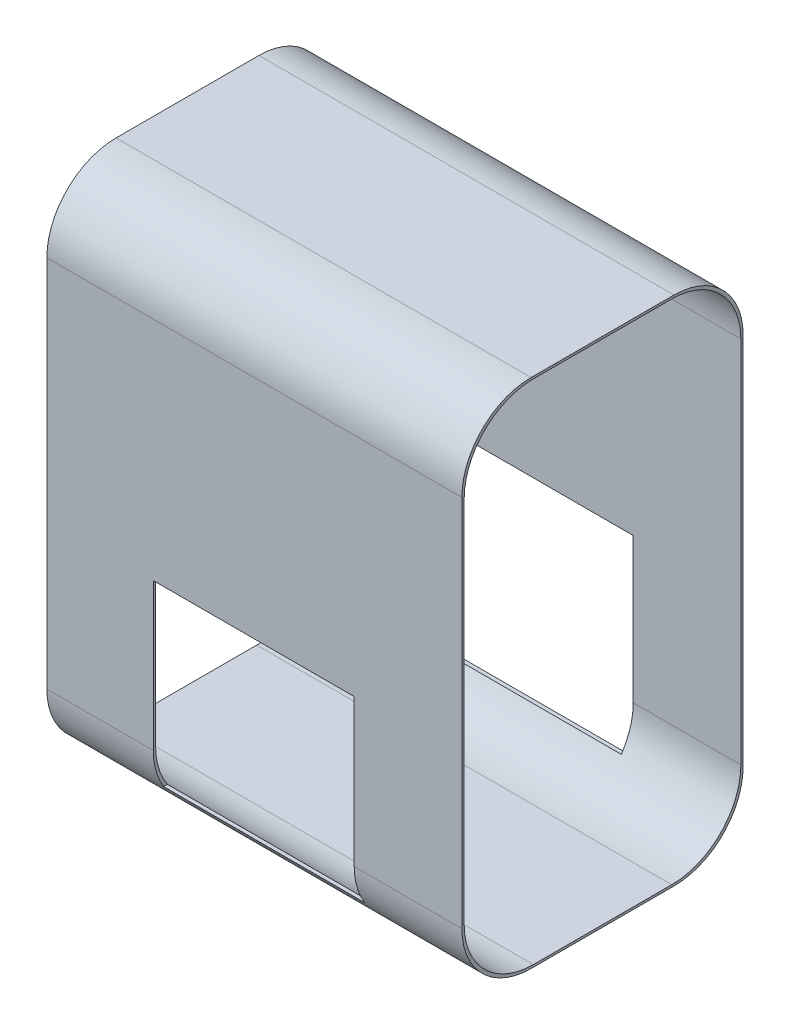
ISO-10303-21;
HEADER;
FILE_DESCRIPTION(('STEP AP214'),'2;1');
FILE_NAME('part.step','',(''),(''),'','','');
FILE_SCHEMA(('AUTOMOTIVE_DESIGN { 1 0 10303 214 1 1 1 1 }'));
ENDSEC;
DATA;
#1=APPLICATION_CONTEXT('core data for automotive mechanical design processes');
#2=APPLICATION_PROTOCOL_DEFINITION('international standard','automotive_design',2000,#1);
#3=PRODUCT_CONTEXT('',#1,'mechanical');
#4=PRODUCT('Part','Part','',(#3));
#5=PRODUCT_RELATED_PRODUCT_CATEGORY('part','',(#4));
#6=PRODUCT_DEFINITION_FORMATION('','',#4);
#7=PRODUCT_DEFINITION_CONTEXT('part definition',#1,'design');
#8=PRODUCT_DEFINITION('design','',#6,#7);
#9=PRODUCT_DEFINITION_SHAPE('','',#8);
#10=(LENGTH_UNIT() NAMED_UNIT(*) SI_UNIT(.MILLI.,.METRE.));
#11=(NAMED_UNIT(*) PLANE_ANGLE_UNIT() SI_UNIT($,.RADIAN.));
#12=(NAMED_UNIT(*) SI_UNIT($,.STERADIAN.) SOLID_ANGLE_UNIT());
#13=UNCERTAINTY_MEASURE_WITH_UNIT(LENGTH_MEASURE(1.E-05),#10,'distance_accuracy_value','');
#14=(GEOMETRIC_REPRESENTATION_CONTEXT(3) GLOBAL_UNCERTAINTY_ASSIGNED_CONTEXT((#13)) GLOBAL_UNIT_ASSIGNED_CONTEXT((#10,
#11,#12)) REPRESENTATION_CONTEXT('',''));
#15=CARTESIAN_POINT('',(0.,0.,0.));
#16=DIRECTION('',(0.,0.,1.));
#17=DIRECTION('',(1.,0.,0.));
#18=AXIS2_PLACEMENT_3D('',#15,#16,#17);
#19=CARTESIAN_POINT('',(4.33194494247,-1.71717262268,-6.1));
#20=DIRECTION('',(0.,1.,0.));
#21=DIRECTION('',(1.,0.,0.));
#22=AXIS2_PLACEMENT_3D('',#19,#20,#21);
#23=PLANE('',#22);
#24=DIRECTION('',(-1.,0.,0.));
#25=VECTOR('',#24,1.);
#26=CARTESIAN_POINT('',(-0.026050567627,-1.71717262268,-6.));
#27=LINE('',#26,#25);
#28=CARTESIAN_POINT('',(4.33194494247,-1.71717262268,-6.));
#29=VERTEX_POINT('',#28);
#30=CARTESIAN_POINT('',(-4.38404607773,-1.71717262268,-6.));
#31=VERTEX_POINT('',#30);
#32=EDGE_CURVE('E403',#29,#31,#27,.T.);
#33=ORIENTED_EDGE('',*,*,#32,.T.);
#34=DIRECTION('',(0.,0.,1.));
#35=VECTOR('',#34,1.);
#36=CARTESIAN_POINT('',(-4.38404607773,-1.71717262268,-6.05));
#37=LINE('',#36,#35);
#38=CARTESIAN_POINT('',(-4.38404607773,-1.71717262268,-6.1));
#39=VERTEX_POINT('',#38);
#40=EDGE_CURVE('E27',#39,#31,#37,.T.);
#41=ORIENTED_EDGE('',*,*,#40,.F.);
#42=DIRECTION('',(1.,0.,0.));
#43=VECTOR('',#42,1.);
#44=CARTESIAN_POINT('',(-0.026050567627,-1.71717262268,-6.1));
#45=LINE('',#44,#43);
#46=CARTESIAN_POINT('',(4.33194494247,-1.71717262268,-6.1));
#47=VERTEX_POINT('',#46);
#48=EDGE_CURVE('E344',#39,#47,#45,.T.);
#49=ORIENTED_EDGE('',*,*,#48,.T.);
#50=DIRECTION('',(0.,0.,1.));
#51=VECTOR('',#50,1.);
#52=CARTESIAN_POINT('',(4.33194494247,-1.71717262268,-6.05));
#53=LINE('',#52,#51);
#54=EDGE_CURVE('E11',#47,#29,#53,.T.);
#55=ORIENTED_EDGE('',*,*,#54,.T.);
#56=EDGE_LOOP('',(#33,#41,#49,#55));
#57=FACE_BOUND('',#56,.T.);
#58=ADVANCED_FACE('F16',(#57),#23,.F.);
#59=CARTESIAN_POINT('',(4.33194494247,-1.71717262268,-6.1));
#60=DIRECTION('',(-1.,0.,0.));
#61=DIRECTION('',(0.,0.,1.));
#62=AXIS2_PLACEMENT_3D('',#59,#60,#61);
#63=PLANE('',#62);
#64=CARTESIAN_POINT('',(4.33194494247,-8.,-3.));
#65=DIRECTION('',(-1.,0.,0.));
#66=DIRECTION('',(0.,1.,0.));
#67=AXIS2_PLACEMENT_3D('',#64,#65,#66);
#68=CIRCLE('',#67,3.);
#69=CARTESIAN_POINT('',(4.33194494247,-8.,-6.));
#70=VERTEX_POINT('',#69);
#71=CARTESIAN_POINT('',(4.33194494247,-9.68055343628,-5.48510364931));
#72=VERTEX_POINT('',#71);
#73=EDGE_CURVE('E477',#70,#72,#68,.T.);
#74=ORIENTED_EDGE('',*,*,#73,.F.);
#75=DIRECTION('',(0.,1.,0.));
#76=VECTOR('',#75,1.);
#77=CARTESIAN_POINT('',(4.33194494247,-4.85858631134,-6.));
#78=LINE('',#77,#76);
#79=EDGE_CURVE('E406',#70,#29,#78,.T.);
#80=ORIENTED_EDGE('',*,*,#79,.T.);
#81=ORIENTED_EDGE('',*,*,#54,.F.);
#82=DIRECTION('',(0.,-1.,0.));
#83=VECTOR('',#82,1.);
#84=CARTESIAN_POINT('',(4.33194494247,-4.90858631134,-6.1));
#85=LINE('',#84,#83);
#86=CARTESIAN_POINT('',(4.33194494247,-8.1,-6.1));
#87=VERTEX_POINT('',#86);
#88=EDGE_CURVE('E340',#47,#87,#85,.T.);
#89=ORIENTED_EDGE('',*,*,#88,.T.);
#90=CARTESIAN_POINT('',(4.33194494247,-8.1,-3.1));
#91=DIRECTION('',(-1.,0.,0.));
#92=DIRECTION('',(0.,1.,0.));
#93=AXIS2_PLACEMENT_3D('',#90,#91,#92);
#94=CIRCLE('',#93,3.);
#95=CARTESIAN_POINT('',(4.33194494247,-9.68055343628,-5.64987270958));
#96=VERTEX_POINT('',#95);
#97=EDGE_CURVE('E367',#87,#96,#94,.T.);
#98=ORIENTED_EDGE('',*,*,#97,.T.);
#99=DIRECTION('',(0.,0.,1.));
#100=VECTOR('',#99,1.);
#101=CARTESIAN_POINT('',(4.33194494247,-9.68055343628,-5.56748817945));
#102=LINE('',#101,#100);
#103=EDGE_CURVE('E260',#96,#72,#102,.T.);
#104=ORIENTED_EDGE('',*,*,#103,.T.);
#105=EDGE_LOOP('',(#74,#80,#81,#89,#98,#104));
#106=FACE_BOUND('',#105,.T.);
#107=ADVANCED_FACE('F632',(#106),#63,.T.);
#108=CARTESIAN_POINT('',(-4.38404607773,-9.68055343628,-6.1));
#109=DIRECTION('',(1.,0.,0.));
#110=DIRECTION('',(0.,1.,0.));
#111=AXIS2_PLACEMENT_3D('',#108,#109,#110);
#112=PLANE('',#111);
#113=DIRECTION('',(0.,1.,0.));
#114=VECTOR('',#113,1.);
#115=CARTESIAN_POINT('',(-4.38404607773,-4.85858631134,-6.));
#116=LINE('',#115,#114);
#117=CARTESIAN_POINT('',(-4.38404607773,-8.,-6.));
#118=VERTEX_POINT('',#117);
#119=EDGE_CURVE('E407',#118,#31,#116,.T.);
#120=ORIENTED_EDGE('',*,*,#119,.F.);
#121=CARTESIAN_POINT('',(-4.38404607773,-8.,-3.));
#122=DIRECTION('',(1.,0.,0.));
#123=DIRECTION('',(0.,1.,0.));
#124=AXIS2_PLACEMENT_3D('',#121,#122,#123);
#125=CIRCLE('',#124,3.);
#126=CARTESIAN_POINT('',(-4.38404607773,-9.68055343628,-5.48510364931));
#127=VERTEX_POINT('',#126);
#128=EDGE_CURVE('E81',#127,#118,#125,.T.);
#129=ORIENTED_EDGE('',*,*,#128,.F.);
#130=DIRECTION('',(0.,0.,1.));
#131=VECTOR('',#130,1.);
#132=CARTESIAN_POINT('',(-4.38404607773,-9.68055343628,-5.56748817945));
#133=LINE('',#132,#131);
#134=CARTESIAN_POINT('',(-4.38404607773,-9.68055343628,-5.64987270958));
#135=VERTEX_POINT('',#134);
#136=EDGE_CURVE('E486',#135,#127,#133,.T.);
#137=ORIENTED_EDGE('',*,*,#136,.F.);
#138=CARTESIAN_POINT('',(-4.38404607773,-8.1,-3.1));
#139=DIRECTION('',(1.,0.,0.));
#140=DIRECTION('',(0.,1.,0.));
#141=AXIS2_PLACEMENT_3D('',#138,#139,#140);
#142=CIRCLE('',#141,3.);
#143=CARTESIAN_POINT('',(-4.38404607773,-8.1,-6.1));
#144=VERTEX_POINT('',#143);
#145=EDGE_CURVE('E368',#135,#144,#142,.T.);
#146=ORIENTED_EDGE('',*,*,#145,.T.);
#147=DIRECTION('',(0.,1.,0.));
#148=VECTOR('',#147,1.);
#149=CARTESIAN_POINT('',(-4.38404607773,-4.90858631134,-6.1));
#150=LINE('',#149,#148);
#151=EDGE_CURVE('E353',#144,#39,#150,.T.);
#152=ORIENTED_EDGE('',*,*,#151,.T.);
#153=ORIENTED_EDGE('',*,*,#40,.T.);
#154=EDGE_LOOP('',(#120,#129,#137,#146,#152,#153));
#155=FACE_BOUND('',#154,.T.);
#156=ADVANCED_FACE('F635',(#155),#112,.T.);
#157=CARTESIAN_POINT('',(-4.38404607773,-9.68055343628,-6.1));
#158=DIRECTION('',(0.,-1.,0.));
#159=DIRECTION('',(0.,0.,-1.));
#160=AXIS2_PLACEMENT_3D('',#157,#158,#159);
#161=PLANE('',#160);
#162=ORIENTED_EDGE('',*,*,#103,.F.);
#163=DIRECTION('',(1.,0.,0.));
#164=VECTOR('',#163,1.);
#165=CARTESIAN_POINT('',(0.,-9.68055343628,-5.64987270958));
#166=LINE('',#165,#164);
#167=EDGE_CURVE('E363',#135,#96,#166,.T.);
#168=ORIENTED_EDGE('',*,*,#167,.F.);
#169=ORIENTED_EDGE('',*,*,#136,.T.);
#170=DIRECTION('',(1.,0.,0.));
#171=VECTOR('',#170,1.);
#172=CARTESIAN_POINT('',(0.,-9.68055343628,-5.48510364931));
#173=LINE('',#172,#171);
#174=EDGE_CURVE('E504',#127,#72,#173,.T.);
#175=ORIENTED_EDGE('',*,*,#174,.T.);
#176=EDGE_LOOP('',(#162,#168,#169,#175));
#177=FACE_BOUND('',#176,.T.);
#178=ADVANCED_FACE('F633',(#177),#161,.F.);
#179=CARTESIAN_POINT('',(4.33194494247,-1.71717262268,-6.1));
#180=DIRECTION('',(0.,1.,0.));
#181=DIRECTION('',(1.,0.,0.));
#182=AXIS2_PLACEMENT_3D('',#179,#180,#181);
#183=PLANE('',#182);
#184=DIRECTION('',(0.,0.,1.));
#185=VECTOR('',#184,1.);
#186=CARTESIAN_POINT('',(4.33194494247,-1.71717262268,6.05));
#187=LINE('',#186,#185);
#188=CARTESIAN_POINT('',(4.33194494247,-1.71717262268,6.));
#189=VERTEX_POINT('',#188);
#190=CARTESIAN_POINT('',(4.33194494247,-1.71717262268,6.1));
#191=VERTEX_POINT('',#190);
#192=EDGE_CURVE('E372',#189,#191,#187,.T.);
#193=ORIENTED_EDGE('',*,*,#192,.T.);
#194=DIRECTION('',(-1.,0.,0.));
#195=VECTOR('',#194,1.);
#196=CARTESIAN_POINT('',(-0.026050567627,-1.71717262268,6.1));
#197=LINE('',#196,#195);
#198=CARTESIAN_POINT('',(-4.38404607773,-1.71717262268,6.1));
#199=VERTEX_POINT('',#198);
#200=EDGE_CURVE('E356',#191,#199,#197,.T.);
#201=ORIENTED_EDGE('',*,*,#200,.T.);
#202=DIRECTION('',(0.,0.,1.));
#203=VECTOR('',#202,1.);
#204=CARTESIAN_POINT('',(-4.38404607773,-1.71717262268,6.05));
#205=LINE('',#204,#203);
#206=CARTESIAN_POINT('',(-4.38404607773,-1.71717262268,6.));
#207=VERTEX_POINT('',#206);
#208=EDGE_CURVE('E41',#207,#199,#205,.T.);
#209=ORIENTED_EDGE('',*,*,#208,.F.);
#210=DIRECTION('',(-1.,0.,0.));
#211=VECTOR('',#210,1.);
#212=CARTESIAN_POINT('',(-0.026050567627,-1.71717262268,6.));
#213=LINE('',#212,#211);
#214=EDGE_CURVE('E435',#189,#207,#213,.T.);
#215=ORIENTED_EDGE('',*,*,#214,.F.);
#216=EDGE_LOOP('',(#193,#201,#209,#215));
#217=FACE_BOUND('',#216,.T.);
#218=ADVANCED_FACE('F718',(#217),#183,.F.);
#219=CARTESIAN_POINT('',(-4.38404607773,-9.68055343628,-6.1));
#220=DIRECTION('',(1.,0.,0.));
#221=DIRECTION('',(0.,1.,0.));
#222=AXIS2_PLACEMENT_3D('',#219,#220,#221);
#223=PLANE('',#222);
#224=CARTESIAN_POINT('',(-4.38404607773,-8.,3.));
#225=DIRECTION('',(1.,0.,0.));
#226=DIRECTION('',(0.,1.,0.));
#227=AXIS2_PLACEMENT_3D('',#224,#225,#226);
#228=CIRCLE('',#227,3.);
#229=CARTESIAN_POINT('',(-4.38404607773,-8.,6.));
#230=VERTEX_POINT('',#229);
#231=CARTESIAN_POINT('',(-4.38404607773,-9.68055343628,5.48510364931));
#232=VERTEX_POINT('',#231);
#233=EDGE_CURVE('E413',#230,#232,#228,.T.);
#234=ORIENTED_EDGE('',*,*,#233,.F.);
#235=DIRECTION('',(0.,1.,0.));
#236=VECTOR('',#235,1.);
#237=CARTESIAN_POINT('',(-4.38404607773,-4.85858631134,6.));
#238=LINE('',#237,#236);
#239=EDGE_CURVE('E458',#230,#207,#238,.T.);
#240=ORIENTED_EDGE('',*,*,#239,.T.);
#241=ORIENTED_EDGE('',*,*,#208,.T.);
#242=DIRECTION('',(0.,1.,0.));
#243=VECTOR('',#242,1.);
#244=CARTESIAN_POINT('',(-4.38404607773,-4.90858631134,6.1));
#245=LINE('',#244,#243);
#246=CARTESIAN_POINT('',(-4.38404607773,-8.1,6.1));
#247=VERTEX_POINT('',#246);
#248=EDGE_CURVE('E249',#247,#199,#245,.T.);
#249=ORIENTED_EDGE('',*,*,#248,.F.);
#250=CARTESIAN_POINT('',(-4.38404607773,-8.1,3.1));
#251=DIRECTION('',(1.,0.,0.));
#252=DIRECTION('',(0.,1.,0.));
#253=AXIS2_PLACEMENT_3D('',#250,#251,#252);
#254=CIRCLE('',#253,3.);
#255=CARTESIAN_POINT('',(-4.38404607773,-9.68055343628,5.64987270958));
#256=VERTEX_POINT('',#255);
#257=EDGE_CURVE('E357',#247,#256,#254,.T.);
#258=ORIENTED_EDGE('',*,*,#257,.T.);
#259=DIRECTION('',(0.,0.,1.));
#260=VECTOR('',#259,1.);
#261=CARTESIAN_POINT('',(-4.38404607773,-9.68055343628,5.56748817945));
#262=LINE('',#261,#260);
#263=EDGE_CURVE('E373',#232,#256,#262,.T.);
#264=ORIENTED_EDGE('',*,*,#263,.F.);
#265=EDGE_LOOP('',(#234,#240,#241,#249,#258,#264));
#266=FACE_BOUND('',#265,.T.);
#267=ADVANCED_FACE('F743',(#266),#223,.T.);
#268=CARTESIAN_POINT('',(4.33194494247,-1.71717262268,-6.1));
#269=DIRECTION('',(-1.,0.,0.));
#270=DIRECTION('',(0.,0.,1.));
#271=AXIS2_PLACEMENT_3D('',#268,#269,#270);
#272=PLANE('',#271);
#273=DIRECTION('',(0.,1.,0.));
#274=VECTOR('',#273,1.);
#275=CARTESIAN_POINT('',(4.33194494247,-4.85858631134,6.));
#276=LINE('',#275,#274);
#277=CARTESIAN_POINT('',(4.33194494247,-8.,6.));
#278=VERTEX_POINT('',#277);
#279=EDGE_CURVE('E431',#278,#189,#276,.T.);
#280=ORIENTED_EDGE('',*,*,#279,.F.);
#281=CARTESIAN_POINT('',(4.33194494247,-8.,3.));
#282=DIRECTION('',(-1.,0.,0.));
#283=DIRECTION('',(0.,1.,0.));
#284=AXIS2_PLACEMENT_3D('',#281,#282,#283);
#285=CIRCLE('',#284,3.);
#286=CARTESIAN_POINT('',(4.33194494247,-9.68055343628,5.48510364931));
#287=VERTEX_POINT('',#286);
#288=EDGE_CURVE('E412',#287,#278,#285,.T.);
#289=ORIENTED_EDGE('',*,*,#288,.F.);
#290=DIRECTION('',(0.,0.,1.));
#291=VECTOR('',#290,1.);
#292=CARTESIAN_POINT('',(4.33194494247,-9.68055343628,5.56748817945));
#293=LINE('',#292,#291);
#294=CARTESIAN_POINT('',(4.33194494247,-9.68055343628,5.64987270958));
#295=VERTEX_POINT('',#294);
#296=EDGE_CURVE('E369',#287,#295,#293,.T.);
#297=ORIENTED_EDGE('',*,*,#296,.T.);
#298=CARTESIAN_POINT('',(4.33194494247,-8.1,3.1));
#299=DIRECTION('',(-1.,0.,0.));
#300=DIRECTION('',(0.,1.,0.));
#301=AXIS2_PLACEMENT_3D('',#298,#299,#300);
#302=CIRCLE('',#301,3.);
#303=CARTESIAN_POINT('',(4.33194494247,-8.1,6.1));
#304=VERTEX_POINT('',#303);
#305=EDGE_CURVE('E417',#295,#304,#302,.T.);
#306=ORIENTED_EDGE('',*,*,#305,.T.);
#307=DIRECTION('',(0.,1.,0.));
#308=VECTOR('',#307,1.);
#309=CARTESIAN_POINT('',(4.33194494247,-4.90858631134,6.1));
#310=LINE('',#309,#308);
#311=EDGE_CURVE('E358',#304,#191,#310,.T.);
#312=ORIENTED_EDGE('',*,*,#311,.T.);
#313=ORIENTED_EDGE('',*,*,#192,.F.);
#314=EDGE_LOOP('',(#280,#289,#297,#306,#312,#313));
#315=FACE_BOUND('',#314,.T.);
#316=ADVANCED_FACE('F581',(#315),#272,.T.);
#317=CARTESIAN_POINT('',(-4.38404607773,-9.68055343628,-6.1));
#318=DIRECTION('',(0.,-1.,0.));
#319=DIRECTION('',(0.,0.,-1.));
#320=AXIS2_PLACEMENT_3D('',#317,#318,#319);
#321=PLANE('',#320);
#322=ORIENTED_EDGE('',*,*,#263,.T.);
#323=DIRECTION('',(1.,0.,0.));
#324=VECTOR('',#323,1.);
#325=CARTESIAN_POINT('',(0.,-9.68055343628,5.64987270958));
#326=LINE('',#325,#324);
#327=EDGE_CURVE('E20',#256,#295,#326,.T.);
#328=ORIENTED_EDGE('',*,*,#327,.T.);
#329=ORIENTED_EDGE('',*,*,#296,.F.);
#330=DIRECTION('',(1.,0.,0.));
#331=VECTOR('',#330,1.);
#332=CARTESIAN_POINT('',(0.,-9.68055343628,5.48510364931));
#333=LINE('',#332,#331);
#334=EDGE_CURVE('E408',#232,#287,#333,.T.);
#335=ORIENTED_EDGE('',*,*,#334,.F.);
#336=EDGE_LOOP('',(#322,#328,#329,#335));
#337=FACE_BOUND('',#336,.T.);
#338=ADVANCED_FACE('F726',(#337),#321,.F.);
#339=CARTESIAN_POINT('',(0.,-11.,6.));
#340=DIRECTION('',(0.,0.,-1.));
#341=DIRECTION('',(0.,-1.,0.));
#342=AXIS2_PLACEMENT_3D('',#339,#340,#341);
#343=PLANE('',#342);
#344=DIRECTION('',(-1.,0.,0.));
#345=VECTOR('',#344,1.);
#346=CARTESIAN_POINT('',(0.,-8.,6.));
#347=LINE('',#346,#345);
#348=CARTESIAN_POINT('',(-9.,-8.,6.));
#349=VERTEX_POINT('',#348);
#350=EDGE_CURVE('E436',#230,#349,#347,.T.);
#351=ORIENTED_EDGE('',*,*,#350,.T.);
#352=DIRECTION('',(0.,-1.,0.));
#353=VECTOR('',#352,1.);
#354=CARTESIAN_POINT('',(-9.,0.,6.));
#355=LINE('',#354,#353);
#356=CARTESIAN_POINT('',(-9.,8.,6.));
#357=VERTEX_POINT('',#356);
#358=EDGE_CURVE('E324',#357,#349,#355,.T.);
#359=ORIENTED_EDGE('',*,*,#358,.F.);
#360=DIRECTION('',(-1.,0.,0.));
#361=VECTOR('',#360,1.);
#362=CARTESIAN_POINT('',(0.,8.,6.));
#363=LINE('',#362,#361);
#364=CARTESIAN_POINT('',(9.,8.,6.));
#365=VERTEX_POINT('',#364);
#366=EDGE_CURVE('E391',#365,#357,#363,.T.);
#367=ORIENTED_EDGE('',*,*,#366,.F.);
#368=DIRECTION('',(0.,-1.,0.));
#369=VECTOR('',#368,1.);
#370=CARTESIAN_POINT('',(9.,0.,6.));
#371=LINE('',#370,#369);
#372=CARTESIAN_POINT('',(9.,-8.,6.));
#373=VERTEX_POINT('',#372);
#374=EDGE_CURVE('E498',#365,#373,#371,.T.);
#375=ORIENTED_EDGE('',*,*,#374,.T.);
#376=DIRECTION('',(-1.,0.,0.));
#377=VECTOR('',#376,1.);
#378=CARTESIAN_POINT('',(0.,-8.,6.));
#379=LINE('',#378,#377);
#380=EDGE_CURVE('E425',#373,#278,#379,.T.);
#381=ORIENTED_EDGE('',*,*,#380,.T.);
#382=ORIENTED_EDGE('',*,*,#279,.T.);
#383=ORIENTED_EDGE('',*,*,#214,.T.);
#384=ORIENTED_EDGE('',*,*,#239,.F.);
#385=EDGE_LOOP('',(#351,#359,#367,#375,#381,#382,#383,#384));
#386=FACE_BOUND('',#385,.T.);
#387=ADVANCED_FACE('F568',(#386),#343,.T.);
#388=CARTESIAN_POINT('',(0.,-8.,3.));
#389=DIRECTION('',(1.,0.,0.));
#390=DIRECTION('',(0.,0.,1.));
#391=AXIS2_PLACEMENT_3D('',#388,#389,#390);
#392=CYLINDRICAL_SURFACE('',#391,3.);
#393=ORIENTED_EDGE('',*,*,#233,.T.);
#394=ORIENTED_EDGE('',*,*,#334,.T.);
#395=ORIENTED_EDGE('',*,*,#288,.T.);
#396=ORIENTED_EDGE('',*,*,#380,.F.);
#397=CARTESIAN_POINT('',(9.,-8.,3.));
#398=DIRECTION('',(-1.,0.,0.));
#399=DIRECTION('',(0.,1.,0.));
#400=AXIS2_PLACEMENT_3D('',#397,#398,#399);
#401=CIRCLE('',#400,3.);
#402=CARTESIAN_POINT('',(9.,-11.,3.));
#403=VERTEX_POINT('',#402);
#404=EDGE_CURVE('E529',#403,#373,#401,.T.);
#405=ORIENTED_EDGE('',*,*,#404,.F.);
#406=DIRECTION('',(-1.,0.,0.));
#407=VECTOR('',#406,1.);
#408=CARTESIAN_POINT('',(0.,-11.,3.));
#409=LINE('',#408,#407);
#410=CARTESIAN_POINT('',(-9.,-11.,3.));
#411=VERTEX_POINT('',#410);
#412=EDGE_CURVE('E451',#403,#411,#409,.T.);
#413=ORIENTED_EDGE('',*,*,#412,.T.);
#414=CARTESIAN_POINT('',(-9.,-8.,3.));
#415=DIRECTION('',(1.,0.,0.));
#416=DIRECTION('',(0.,1.,0.));
#417=AXIS2_PLACEMENT_3D('',#414,#415,#416);
#418=CIRCLE('',#417,3.);
#419=EDGE_CURVE('E327',#349,#411,#418,.T.);
#420=ORIENTED_EDGE('',*,*,#419,.F.);
#421=ORIENTED_EDGE('',*,*,#350,.F.);
#422=EDGE_LOOP('',(#393,#394,#395,#396,#405,#413,#420,#421));
#423=FACE_BOUND('',#422,.T.);
#424=ADVANCED_FACE('F575',(#423),#392,.F.);
#425=CARTESIAN_POINT('',(0.,-8.,-3.));
#426=DIRECTION('',(1.,0.,0.));
#427=DIRECTION('',(0.,-1.,0.));
#428=AXIS2_PLACEMENT_3D('',#425,#426,#427);
#429=CYLINDRICAL_SURFACE('',#428,3.);
#430=ORIENTED_EDGE('',*,*,#73,.T.);
#431=ORIENTED_EDGE('',*,*,#174,.F.);
#432=ORIENTED_EDGE('',*,*,#128,.T.);
#433=DIRECTION('',(-1.,0.,0.));
#434=VECTOR('',#433,1.);
#435=CARTESIAN_POINT('',(-6.69202303886,-8.,-6.));
#436=LINE('',#435,#434);
#437=CARTESIAN_POINT('',(-9.,-8.,-6.));
#438=VERTEX_POINT('',#437);
#439=EDGE_CURVE('E473',#118,#438,#436,.T.);
#440=ORIENTED_EDGE('',*,*,#439,.T.);
#441=CARTESIAN_POINT('',(-9.,-8.,-3.));
#442=DIRECTION('',(1.,0.,0.));
#443=DIRECTION('',(0.,1.,0.));
#444=AXIS2_PLACEMENT_3D('',#441,#442,#443);
#445=CIRCLE('',#444,3.);
#446=CARTESIAN_POINT('',(-9.,-11.,-3.));
#447=VERTEX_POINT('',#446);
#448=EDGE_CURVE('E492',#447,#438,#445,.T.);
#449=ORIENTED_EDGE('',*,*,#448,.F.);
#450=DIRECTION('',(-1.,0.,0.));
#451=VECTOR('',#450,1.);
#452=CARTESIAN_POINT('',(0.,-11.,-3.));
#453=LINE('',#452,#451);
#454=CARTESIAN_POINT('',(9.,-11.,-3.));
#455=VERTEX_POINT('',#454);
#456=EDGE_CURVE('E382',#455,#447,#453,.T.);
#457=ORIENTED_EDGE('',*,*,#456,.F.);
#458=CARTESIAN_POINT('',(9.,-8.,-3.));
#459=DIRECTION('',(-1.,0.,0.));
#460=DIRECTION('',(0.,1.,0.));
#461=AXIS2_PLACEMENT_3D('',#458,#459,#460);
#462=CIRCLE('',#461,3.);
#463=CARTESIAN_POINT('',(9.,-8.,-6.));
#464=VERTEX_POINT('',#463);
#465=EDGE_CURVE('E338',#464,#455,#462,.T.);
#466=ORIENTED_EDGE('',*,*,#465,.F.);
#467=DIRECTION('',(-1.,0.,0.));
#468=VECTOR('',#467,1.);
#469=CARTESIAN_POINT('',(6.66597247124,-8.,-6.));
#470=LINE('',#469,#468);
#471=EDGE_CURVE('E362',#464,#70,#470,.T.);
#472=ORIENTED_EDGE('',*,*,#471,.T.);
#473=EDGE_LOOP('',(#430,#431,#432,#440,#449,#457,#466,#472));
#474=FACE_BOUND('',#473,.T.);
#475=ADVANCED_FACE('F610',(#474),#429,.F.);
#476=CARTESIAN_POINT('',(0.,11.,-6.));
#477=DIRECTION('',(0.,0.,1.));
#478=DIRECTION('',(1.,0.,0.));
#479=AXIS2_PLACEMENT_3D('',#476,#477,#478);
#480=PLANE('',#479);
#481=ORIENTED_EDGE('',*,*,#471,.F.);
#482=DIRECTION('',(0.,1.,0.));
#483=VECTOR('',#482,1.);
#484=CARTESIAN_POINT('',(9.,0.,-6.));
#485=LINE('',#484,#483);
#486=CARTESIAN_POINT('',(9.,8.,-6.));
#487=VERTEX_POINT('',#486);
#488=EDGE_CURVE('E335',#464,#487,#485,.T.);
#489=ORIENTED_EDGE('',*,*,#488,.T.);
#490=DIRECTION('',(-1.,0.,0.));
#491=VECTOR('',#490,1.);
#492=CARTESIAN_POINT('',(0.,8.,-6.));
#493=LINE('',#492,#491);
#494=CARTESIAN_POINT('',(-9.,8.,-6.));
#495=VERTEX_POINT('',#494);
#496=EDGE_CURVE('E378',#487,#495,#493,.T.);
#497=ORIENTED_EDGE('',*,*,#496,.T.);
#498=DIRECTION('',(0.,1.,0.));
#499=VECTOR('',#498,1.);
#500=CARTESIAN_POINT('',(-9.,0.,-6.));
#501=LINE('',#500,#499);
#502=EDGE_CURVE('E489',#438,#495,#501,.T.);
#503=ORIENTED_EDGE('',*,*,#502,.F.);
#504=ORIENTED_EDGE('',*,*,#439,.F.);
#505=ORIENTED_EDGE('',*,*,#119,.T.);
#506=ORIENTED_EDGE('',*,*,#32,.F.);
#507=ORIENTED_EDGE('',*,*,#79,.F.);
#508=EDGE_LOOP('',(#481,#489,#497,#503,#504,#505,#506,#507));
#509=FACE_BOUND('',#508,.T.);
#510=ADVANCED_FACE('F615',(#509),#480,.T.);
#511=CARTESIAN_POINT('',(0.,-11.1,6.1));
#512=DIRECTION('',(0.,0.,-1.));
#513=DIRECTION('',(0.,-1.,0.));
#514=AXIS2_PLACEMENT_3D('',#511,#512,#513);
#515=PLANE('',#514);
#516=ORIENTED_EDGE('',*,*,#248,.T.);
#517=ORIENTED_EDGE('',*,*,#200,.F.);
#518=ORIENTED_EDGE('',*,*,#311,.F.);
#519=DIRECTION('',(1.,0.,0.));
#520=VECTOR('',#519,1.);
#521=CARTESIAN_POINT('',(0.,-8.1,6.1));
#522=LINE('',#521,#520);
#523=CARTESIAN_POINT('',(9.,-8.1,6.1));
#524=VERTEX_POINT('',#523);
#525=EDGE_CURVE('E414',#304,#524,#522,.T.);
#526=ORIENTED_EDGE('',*,*,#525,.T.);
#527=DIRECTION('',(0.,-1.,0.));
#528=VECTOR('',#527,1.);
#529=CARTESIAN_POINT('',(9.,0.,6.1));
#530=LINE('',#529,#528);
#531=CARTESIAN_POINT('',(9.,8.1,6.1));
#532=VERTEX_POINT('',#531);
#533=EDGE_CURVE('E288',#532,#524,#530,.T.);
#534=ORIENTED_EDGE('',*,*,#533,.F.);
#535=DIRECTION('',(1.,0.,0.));
#536=VECTOR('',#535,1.);
#537=CARTESIAN_POINT('',(0.,8.1,6.1));
#538=LINE('',#537,#536);
#539=CARTESIAN_POINT('',(-9.,8.1,6.1));
#540=VERTEX_POINT('',#539);
#541=EDGE_CURVE('E426',#540,#532,#538,.T.);
#542=ORIENTED_EDGE('',*,*,#541,.F.);
#543=DIRECTION('',(0.,-1.,0.));
#544=VECTOR('',#543,1.);
#545=CARTESIAN_POINT('',(-9.,0.,6.1));
#546=LINE('',#545,#544);
#547=CARTESIAN_POINT('',(-9.,-8.1,6.1));
#548=VERTEX_POINT('',#547);
#549=EDGE_CURVE('E328',#540,#548,#546,.T.);
#550=ORIENTED_EDGE('',*,*,#549,.T.);
#551=DIRECTION('',(1.,0.,0.));
#552=VECTOR('',#551,1.);
#553=CARTESIAN_POINT('',(0.,-8.1,6.1));
#554=LINE('',#553,#552);
#555=EDGE_CURVE('E418',#548,#247,#554,.T.);
#556=ORIENTED_EDGE('',*,*,#555,.T.);
#557=EDGE_LOOP('',(#516,#517,#518,#526,#534,#542,#550,#556));
#558=FACE_BOUND('',#557,.T.);
#559=ADVANCED_FACE('F18',(#558),#515,.F.);
#560=CARTESIAN_POINT('',(0.,-8.1,3.1));
#561=DIRECTION('',(1.,0.,0.));
#562=DIRECTION('',(0.,0.,1.));
#563=AXIS2_PLACEMENT_3D('',#560,#561,#562);
#564=CYLINDRICAL_SURFACE('',#563,3.);
#565=ORIENTED_EDGE('',*,*,#555,.F.);
#566=CARTESIAN_POINT('',(-9.,-8.1,3.1));
#567=DIRECTION('',(1.,0.,0.));
#568=DIRECTION('',(0.,1.,0.));
#569=AXIS2_PLACEMENT_3D('',#566,#567,#568);
#570=CIRCLE('',#569,3.);
#571=CARTESIAN_POINT('',(-9.,-11.1,3.1));
#572=VERTEX_POINT('',#571);
#573=EDGE_CURVE('E298',#548,#572,#570,.T.);
#574=ORIENTED_EDGE('',*,*,#573,.T.);
#575=DIRECTION('',(1.,0.,0.));
#576=VECTOR('',#575,1.);
#577=CARTESIAN_POINT('',(0.,-11.1,3.1));
#578=LINE('',#577,#576);
#579=CARTESIAN_POINT('',(9.,-11.1,3.1));
#580=VERTEX_POINT('',#579);
#581=EDGE_CURVE('E295',#572,#580,#578,.T.);
#582=ORIENTED_EDGE('',*,*,#581,.T.);
#583=CARTESIAN_POINT('',(9.,-8.1,3.1));
#584=DIRECTION('',(-1.,0.,0.));
#585=DIRECTION('',(0.,1.,0.));
#586=AXIS2_PLACEMENT_3D('',#583,#584,#585);
#587=CIRCLE('',#586,3.);
#588=EDGE_CURVE('E280',#580,#524,#587,.T.);
#589=ORIENTED_EDGE('',*,*,#588,.T.);
#590=ORIENTED_EDGE('',*,*,#525,.F.);
#591=ORIENTED_EDGE('',*,*,#305,.F.);
#592=ORIENTED_EDGE('',*,*,#327,.F.);
#593=ORIENTED_EDGE('',*,*,#257,.F.);
#594=EDGE_LOOP('',(#565,#574,#582,#589,#590,#591,#592,#593));
#595=FACE_BOUND('',#594,.T.);
#596=ADVANCED_FACE('F296',(#595),#564,.T.);
#597=CARTESIAN_POINT('',(0.,-8.1,-3.1));
#598=DIRECTION('',(1.,0.,0.));
#599=DIRECTION('',(0.,-1.,0.));
#600=AXIS2_PLACEMENT_3D('',#597,#598,#599);
#601=CYLINDRICAL_SURFACE('',#600,3.);
#602=DIRECTION('',(1.,0.,0.));
#603=VECTOR('',#602,1.);
#604=CARTESIAN_POINT('',(6.66597247124,-8.1,-6.1));
#605=LINE('',#604,#603);
#606=CARTESIAN_POINT('',(9.,-8.1,-6.1));
#607=VERTEX_POINT('',#606);
#608=EDGE_CURVE('E483',#87,#607,#605,.T.);
#609=ORIENTED_EDGE('',*,*,#608,.T.);
#610=CARTESIAN_POINT('',(9.,-8.1,-3.1));
#611=DIRECTION('',(-1.,0.,0.));
#612=DIRECTION('',(0.,1.,0.));
#613=AXIS2_PLACEMENT_3D('',#610,#611,#612);
#614=CIRCLE('',#613,3.);
#615=CARTESIAN_POINT('',(9.,-11.1,-3.1));
#616=VERTEX_POINT('',#615);
#617=EDGE_CURVE('E292',#607,#616,#614,.T.);
#618=ORIENTED_EDGE('',*,*,#617,.T.);
#619=DIRECTION('',(1.,0.,0.));
#620=VECTOR('',#619,1.);
#621=CARTESIAN_POINT('',(0.,-11.1,-3.1));
#622=LINE('',#621,#620);
#623=CARTESIAN_POINT('',(-9.,-11.1,-3.1));
#624=VERTEX_POINT('',#623);
#625=EDGE_CURVE('E307',#624,#616,#622,.T.);
#626=ORIENTED_EDGE('',*,*,#625,.F.);
#627=CARTESIAN_POINT('',(-9.,-8.1,-3.1));
#628=DIRECTION('',(1.,0.,0.));
#629=DIRECTION('',(0.,1.,0.));
#630=AXIS2_PLACEMENT_3D('',#627,#628,#629);
#631=CIRCLE('',#630,3.);
#632=CARTESIAN_POINT('',(-9.,-8.1,-6.1));
#633=VERTEX_POINT('',#632);
#634=EDGE_CURVE('E401',#624,#633,#631,.T.);
#635=ORIENTED_EDGE('',*,*,#634,.T.);
#636=DIRECTION('',(1.,0.,0.));
#637=VECTOR('',#636,1.);
#638=CARTESIAN_POINT('',(-6.69202303886,-8.1,-6.1));
#639=LINE('',#638,#637);
#640=EDGE_CURVE('E441',#633,#144,#639,.T.);
#641=ORIENTED_EDGE('',*,*,#640,.T.);
#642=ORIENTED_EDGE('',*,*,#145,.F.);
#643=ORIENTED_EDGE('',*,*,#167,.T.);
#644=ORIENTED_EDGE('',*,*,#97,.F.);
#645=EDGE_LOOP('',(#609,#618,#626,#635,#641,#642,#643,#644));
#646=FACE_BOUND('',#645,.T.);
#647=ADVANCED_FACE('F645',(#646),#601,.T.);
#648=CARTESIAN_POINT('',(0.,11.1,-6.1));
#649=DIRECTION('',(0.,0.,1.));
#650=DIRECTION('',(1.,0.,0.));
#651=AXIS2_PLACEMENT_3D('',#648,#649,#650);
#652=PLANE('',#651);
#653=ORIENTED_EDGE('',*,*,#88,.F.);
#654=ORIENTED_EDGE('',*,*,#48,.F.);
#655=ORIENTED_EDGE('',*,*,#151,.F.);
#656=ORIENTED_EDGE('',*,*,#640,.F.);
#657=DIRECTION('',(0.,1.,0.));
#658=VECTOR('',#657,1.);
#659=CARTESIAN_POINT('',(-9.,0.,-6.1));
#660=LINE('',#659,#658);
#661=CARTESIAN_POINT('',(-9.,8.1,-6.1));
#662=VERTEX_POINT('',#661);
#663=EDGE_CURVE('E397',#633,#662,#660,.T.);
#664=ORIENTED_EDGE('',*,*,#663,.T.);
#665=DIRECTION('',(1.,0.,0.));
#666=VECTOR('',#665,1.);
#667=CARTESIAN_POINT('',(0.,8.1,-6.1));
#668=LINE('',#667,#666);
#669=CARTESIAN_POINT('',(9.,8.1,-6.1));
#670=VERTEX_POINT('',#669);
#671=EDGE_CURVE('E345',#662,#670,#668,.T.);
#672=ORIENTED_EDGE('',*,*,#671,.T.);
#673=DIRECTION('',(0.,1.,0.));
#674=VECTOR('',#673,1.);
#675=CARTESIAN_POINT('',(9.,0.,-6.1));
#676=LINE('',#675,#674);
#677=EDGE_CURVE('E462',#607,#670,#676,.T.);
#678=ORIENTED_EDGE('',*,*,#677,.F.);
#679=ORIENTED_EDGE('',*,*,#608,.F.);
#680=EDGE_LOOP('',(#653,#654,#655,#656,#664,#672,#678,#679));
#681=FACE_BOUND('',#680,.T.);
#682=ADVANCED_FACE('F641',(#681),#652,.F.);
#683=CARTESIAN_POINT('',(0.,8.1,-3.1));
#684=DIRECTION('',(1.,0.,0.));
#685=DIRECTION('',(0.,0.,-1.));
#686=AXIS2_PLACEMENT_3D('',#683,#684,#685);
#687=CYLINDRICAL_SURFACE('',#686,3.);
#688=CARTESIAN_POINT('',(9.,8.1,-3.1));
#689=DIRECTION('',(-1.,0.,0.));
#690=DIRECTION('',(0.,1.,0.));
#691=AXIS2_PLACEMENT_3D('',#688,#689,#690);
#692=CIRCLE('',#691,3.);
#693=CARTESIAN_POINT('',(9.,11.1,-3.1));
#694=VERTEX_POINT('',#693);
#695=EDGE_CURVE('E339',#694,#670,#692,.T.);
#696=ORIENTED_EDGE('',*,*,#695,.T.);
#697=ORIENTED_EDGE('',*,*,#671,.F.);
#698=CARTESIAN_POINT('',(-9.,8.1,-3.1));
#699=DIRECTION('',(1.,0.,0.));
#700=DIRECTION('',(0.,1.,0.));
#701=AXIS2_PLACEMENT_3D('',#698,#699,#700);
#702=CIRCLE('',#701,3.);
#703=CARTESIAN_POINT('',(-9.,11.1,-3.1));
#704=VERTEX_POINT('',#703);
#705=EDGE_CURVE('E402',#662,#704,#702,.T.);
#706=ORIENTED_EDGE('',*,*,#705,.T.);
#707=DIRECTION('',(1.,0.,0.));
#708=VECTOR('',#707,1.);
#709=CARTESIAN_POINT('',(0.,11.1,-3.1));
#710=LINE('',#709,#708);
#711=EDGE_CURVE('E455',#704,#694,#710,.T.);
#712=ORIENTED_EDGE('',*,*,#711,.T.);
#713=EDGE_LOOP('',(#696,#697,#706,#712));
#714=FACE_BOUND('',#713,.T.);
#715=ADVANCED_FACE('F710',(#714),#687,.T.);
#716=CARTESIAN_POINT('',(-9.,0.,0.));
#717=DIRECTION('',(1.,0.,0.));
#718=DIRECTION('',(0.,1.,0.));
#719=AXIS2_PLACEMENT_3D('',#716,#717,#718);
#720=PLANE('',#719);
#721=DIRECTION('',(0.,0.,1.));
#722=VECTOR('',#721,1.);
#723=CARTESIAN_POINT('',(-9.,11.,0.));
#724=LINE('',#723,#722);
#725=CARTESIAN_POINT('',(-9.,11.,-3.));
#726=VERTEX_POINT('',#725);
#727=CARTESIAN_POINT('',(-9.,11.,3.));
#728=VERTEX_POINT('',#727);
#729=EDGE_CURVE('E330',#726,#728,#724,.T.);
#730=ORIENTED_EDGE('',*,*,#729,.T.);
#731=CARTESIAN_POINT('',(-9.,8.,3.));
#732=DIRECTION('',(1.,0.,0.));
#733=DIRECTION('',(0.,1.,0.));
#734=AXIS2_PLACEMENT_3D('',#731,#732,#733);
#735=CIRCLE('',#734,3.);
#736=EDGE_CURVE('E348',#728,#357,#735,.T.);
#737=ORIENTED_EDGE('',*,*,#736,.T.);
#738=ORIENTED_EDGE('',*,*,#358,.T.);
#739=ORIENTED_EDGE('',*,*,#419,.T.);
#740=DIRECTION('',(0.,0.,-1.));
#741=VECTOR('',#740,1.);
#742=CARTESIAN_POINT('',(-9.,-11.,0.));
#743=LINE('',#742,#741);
#744=EDGE_CURVE('E430',#411,#447,#743,.T.);
#745=ORIENTED_EDGE('',*,*,#744,.T.);
#746=ORIENTED_EDGE('',*,*,#448,.T.);
#747=ORIENTED_EDGE('',*,*,#502,.T.);
#748=CARTESIAN_POINT('',(-9.,8.,-3.));
#749=DIRECTION('',(1.,0.,0.));
#750=DIRECTION('',(0.,1.,0.));
#751=AXIS2_PLACEMENT_3D('',#748,#749,#750);
#752=CIRCLE('',#751,3.);
#753=EDGE_CURVE('E314',#495,#726,#752,.T.);
#754=ORIENTED_EDGE('',*,*,#753,.T.);
#755=EDGE_LOOP('',(#730,#737,#738,#739,#745,#746,#747,#754));
#756=FACE_BOUND('',#755,.T.);
#757=ORIENTED_EDGE('',*,*,#705,.F.);
#758=ORIENTED_EDGE('',*,*,#663,.F.);
#759=ORIENTED_EDGE('',*,*,#634,.F.);
#760=DIRECTION('',(0.,0.,-1.));
#761=VECTOR('',#760,1.);
#762=CARTESIAN_POINT('',(-9.,-11.1,0.));
#763=LINE('',#762,#761);
#764=EDGE_CURVE('E303',#572,#624,#763,.T.);
#765=ORIENTED_EDGE('',*,*,#764,.F.);
#766=ORIENTED_EDGE('',*,*,#573,.F.);
#767=ORIENTED_EDGE('',*,*,#549,.F.);
#768=CARTESIAN_POINT('',(-9.,8.1,3.1));
#769=DIRECTION('',(1.,0.,0.));
#770=DIRECTION('',(0.,1.,0.));
#771=AXIS2_PLACEMENT_3D('',#768,#769,#770);
#772=CIRCLE('',#771,3.);
#773=CARTESIAN_POINT('',(-9.,11.1,3.1));
#774=VERTEX_POINT('',#773);
#775=EDGE_CURVE('E322',#774,#540,#772,.T.);
#776=ORIENTED_EDGE('',*,*,#775,.F.);
#777=DIRECTION('',(0.,0.,1.));
#778=VECTOR('',#777,1.);
#779=CARTESIAN_POINT('',(-9.,11.1,0.));
#780=LINE('',#779,#778);
#781=EDGE_CURVE('E396',#704,#774,#780,.T.);
#782=ORIENTED_EDGE('',*,*,#781,.F.);
#783=EDGE_LOOP('',(#757,#758,#759,#765,#766,#767,#776,#782));
#784=FACE_BOUND('',#783,.T.);
#785=ADVANCED_FACE('F604',(#756,#784),#720,.F.);
#786=CARTESIAN_POINT('',(9.,0.,0.));
#787=DIRECTION('',(1.,0.,0.));
#788=DIRECTION('',(0.,1.,0.));
#789=AXIS2_PLACEMENT_3D('',#786,#787,#788);
#790=PLANE('',#789);
#791=CARTESIAN_POINT('',(9.,8.,-3.));
#792=DIRECTION('',(-1.,0.,0.));
#793=DIRECTION('',(0.,1.,0.));
#794=AXIS2_PLACEMENT_3D('',#791,#792,#793);
#795=CIRCLE('',#794,3.);
#796=CARTESIAN_POINT('',(9.,11.,-3.));
#797=VERTEX_POINT('',#796);
#798=EDGE_CURVE('E374',#797,#487,#795,.T.);
#799=ORIENTED_EDGE('',*,*,#798,.T.);
#800=ORIENTED_EDGE('',*,*,#488,.F.);
#801=ORIENTED_EDGE('',*,*,#465,.T.);
#802=DIRECTION('',(0.,0.,-1.));
#803=VECTOR('',#802,1.);
#804=CARTESIAN_POINT('',(9.,-11.,0.));
#805=LINE('',#804,#803);
#806=EDGE_CURVE('E386',#403,#455,#805,.T.);
#807=ORIENTED_EDGE('',*,*,#806,.F.);
#808=ORIENTED_EDGE('',*,*,#404,.T.);
#809=ORIENTED_EDGE('',*,*,#374,.F.);
#810=CARTESIAN_POINT('',(9.,8.,3.));
#811=DIRECTION('',(-1.,0.,0.));
#812=DIRECTION('',(0.,1.,0.));
#813=AXIS2_PLACEMENT_3D('',#810,#811,#812);
#814=CIRCLE('',#813,3.);
#815=CARTESIAN_POINT('',(9.,11.,3.));
#816=VERTEX_POINT('',#815);
#817=EDGE_CURVE('E387',#365,#816,#814,.T.);
#818=ORIENTED_EDGE('',*,*,#817,.T.);
#819=DIRECTION('',(0.,0.,1.));
#820=VECTOR('',#819,1.);
#821=CARTESIAN_POINT('',(9.,11.,0.));
#822=LINE('',#821,#820);
#823=EDGE_CURVE('E334',#797,#816,#822,.T.);
#824=ORIENTED_EDGE('',*,*,#823,.F.);
#825=EDGE_LOOP('',(#799,#800,#801,#807,#808,#809,#818,#824));
#826=FACE_BOUND('',#825,.T.);
#827=DIRECTION('',(0.,0.,1.));
#828=VECTOR('',#827,1.);
#829=CARTESIAN_POINT('',(9.,11.1,0.));
#830=LINE('',#829,#828);
#831=CARTESIAN_POINT('',(9.,11.1,3.1));
#832=VERTEX_POINT('',#831);
#833=EDGE_CURVE('E393',#694,#832,#830,.T.);
#834=ORIENTED_EDGE('',*,*,#833,.T.);
#835=CARTESIAN_POINT('',(9.,8.1,3.1));
#836=DIRECTION('',(-1.,0.,0.));
#837=DIRECTION('',(0.,1.,0.));
#838=AXIS2_PLACEMENT_3D('',#835,#836,#837);
#839=CIRCLE('',#838,3.);
#840=EDGE_CURVE('E323',#532,#832,#839,.T.);
#841=ORIENTED_EDGE('',*,*,#840,.F.);
#842=ORIENTED_EDGE('',*,*,#533,.T.);
#843=ORIENTED_EDGE('',*,*,#588,.F.);
#844=DIRECTION('',(0.,0.,-1.));
#845=VECTOR('',#844,1.);
#846=CARTESIAN_POINT('',(9.,-11.1,0.));
#847=LINE('',#846,#845);
#848=EDGE_CURVE('E285',#580,#616,#847,.T.);
#849=ORIENTED_EDGE('',*,*,#848,.T.);
#850=ORIENTED_EDGE('',*,*,#617,.F.);
#851=ORIENTED_EDGE('',*,*,#677,.T.);
#852=ORIENTED_EDGE('',*,*,#695,.F.);
#853=EDGE_LOOP('',(#834,#841,#842,#843,#849,#850,#851,#852));
#854=FACE_BOUND('',#853,.T.);
#855=ADVANCED_FACE('F282',(#826,#854),#790,.T.);
#856=CARTESIAN_POINT('',(0.,11.1,6.1));
#857=DIRECTION('',(0.,-1.,0.));
#858=DIRECTION('',(0.,0.,-1.));
#859=AXIS2_PLACEMENT_3D('',#856,#857,#858);
#860=PLANE('',#859);
#861=ORIENTED_EDGE('',*,*,#711,.F.);
#862=ORIENTED_EDGE('',*,*,#781,.T.);
#863=DIRECTION('',(1.,0.,0.));
#864=VECTOR('',#863,1.);
#865=CARTESIAN_POINT('',(0.,11.1,3.1));
#866=LINE('',#865,#864);
#867=EDGE_CURVE('E319',#774,#832,#866,.T.);
#868=ORIENTED_EDGE('',*,*,#867,.T.);
#869=ORIENTED_EDGE('',*,*,#833,.F.);
#870=EDGE_LOOP('',(#861,#862,#868,#869));
#871=FACE_BOUND('',#870,.T.);
#872=ADVANCED_FACE('F731',(#871),#860,.F.);
#873=CARTESIAN_POINT('',(0.,-11.1,-6.1));
#874=DIRECTION('',(0.,1.,0.));
#875=DIRECTION('',(1.,0.,0.));
#876=AXIS2_PLACEMENT_3D('',#873,#874,#875);
#877=PLANE('',#876);
#878=ORIENTED_EDGE('',*,*,#625,.T.);
#879=ORIENTED_EDGE('',*,*,#848,.F.);
#880=ORIENTED_EDGE('',*,*,#581,.F.);
#881=ORIENTED_EDGE('',*,*,#764,.T.);
#882=EDGE_LOOP('',(#878,#879,#880,#881));
#883=FACE_BOUND('',#882,.T.);
#884=ADVANCED_FACE('F305',(#883),#877,.F.);
#885=CARTESIAN_POINT('',(0.,8.,-3.));
#886=DIRECTION('',(1.,0.,0.));
#887=DIRECTION('',(0.,0.,-1.));
#888=AXIS2_PLACEMENT_3D('',#885,#886,#887);
#889=CYLINDRICAL_SURFACE('',#888,3.);
#890=ORIENTED_EDGE('',*,*,#496,.F.);
#891=ORIENTED_EDGE('',*,*,#798,.F.);
#892=DIRECTION('',(-1.,0.,0.));
#893=VECTOR('',#892,1.);
#894=CARTESIAN_POINT('',(0.,11.,-3.));
#895=LINE('',#894,#893);
#896=EDGE_CURVE('E333',#797,#726,#895,.T.);
#897=ORIENTED_EDGE('',*,*,#896,.T.);
#898=ORIENTED_EDGE('',*,*,#753,.F.);
#899=EDGE_LOOP('',(#890,#891,#897,#898));
#900=FACE_BOUND('',#899,.T.);
#901=ADVANCED_FACE('F619',(#900),#889,.F.);
#902=CARTESIAN_POINT('',(0.,11.,6.));
#903=DIRECTION('',(0.,-1.,0.));
#904=DIRECTION('',(0.,0.,-1.));
#905=AXIS2_PLACEMENT_3D('',#902,#903,#904);
#906=PLANE('',#905);
#907=ORIENTED_EDGE('',*,*,#823,.T.);
#908=DIRECTION('',(-1.,0.,0.));
#909=VECTOR('',#908,1.);
#910=CARTESIAN_POINT('',(0.,11.,3.));
#911=LINE('',#910,#909);
#912=EDGE_CURVE('E392',#816,#728,#911,.T.);
#913=ORIENTED_EDGE('',*,*,#912,.T.);
#914=ORIENTED_EDGE('',*,*,#729,.F.);
#915=ORIENTED_EDGE('',*,*,#896,.F.);
#916=EDGE_LOOP('',(#907,#913,#914,#915));
#917=FACE_BOUND('',#916,.T.);
#918=ADVANCED_FACE('F624',(#917),#906,.T.);
#919=CARTESIAN_POINT('',(0.,-11.,-6.));
#920=DIRECTION('',(0.,1.,0.));
#921=DIRECTION('',(1.,0.,0.));
#922=AXIS2_PLACEMENT_3D('',#919,#920,#921);
#923=PLANE('',#922);
#924=ORIENTED_EDGE('',*,*,#744,.F.);
#925=ORIENTED_EDGE('',*,*,#412,.F.);
#926=ORIENTED_EDGE('',*,*,#806,.T.);
#927=ORIENTED_EDGE('',*,*,#456,.T.);
#928=EDGE_LOOP('',(#924,#925,#926,#927));
#929=FACE_BOUND('',#928,.T.);
#930=ADVANCED_FACE('F607',(#929),#923,.T.);
#931=CARTESIAN_POINT('',(0.,8.1,3.1));
#932=DIRECTION('',(1.,0.,0.));
#933=DIRECTION('',(0.,1.,0.));
#934=AXIS2_PLACEMENT_3D('',#931,#932,#933);
#935=CYLINDRICAL_SURFACE('',#934,3.);
#936=ORIENTED_EDGE('',*,*,#840,.T.);
#937=ORIENTED_EDGE('',*,*,#867,.F.);
#938=ORIENTED_EDGE('',*,*,#775,.T.);
#939=ORIENTED_EDGE('',*,*,#541,.T.);
#940=EDGE_LOOP('',(#936,#937,#938,#939));
#941=FACE_BOUND('',#940,.T.);
#942=ADVANCED_FACE('F748',(#941),#935,.T.);
#943=CARTESIAN_POINT('',(0.,8.,3.));
#944=DIRECTION('',(1.,0.,0.));
#945=DIRECTION('',(0.,1.,0.));
#946=AXIS2_PLACEMENT_3D('',#943,#944,#945);
#947=CYLINDRICAL_SURFACE('',#946,3.);
#948=ORIENTED_EDGE('',*,*,#912,.F.);
#949=ORIENTED_EDGE('',*,*,#817,.F.);
#950=ORIENTED_EDGE('',*,*,#366,.T.);
#951=ORIENTED_EDGE('',*,*,#736,.F.);
#952=EDGE_LOOP('',(#948,#949,#950,#951));
#953=FACE_BOUND('',#952,.T.);
#954=ADVANCED_FACE('F628',(#953),#947,.F.);
#955=CLOSED_SHELL('',(#58,#107,#156,#178,#218,#267,#316,#338,#387,#424,#475,#510,#559,#596,#647,
#682,#715,#785,#855,#872,#884,#901,#918,#930,#942,#954));
#956=MANIFOLD_SOLID_BREP('B1',#955);
#957=ADVANCED_BREP_SHAPE_REPRESENTATION('',(#18,#956),#14);
#958=SHAPE_DEFINITION_REPRESENTATION(#9,#957);
ENDSEC;
END-ISO-10303-21;
